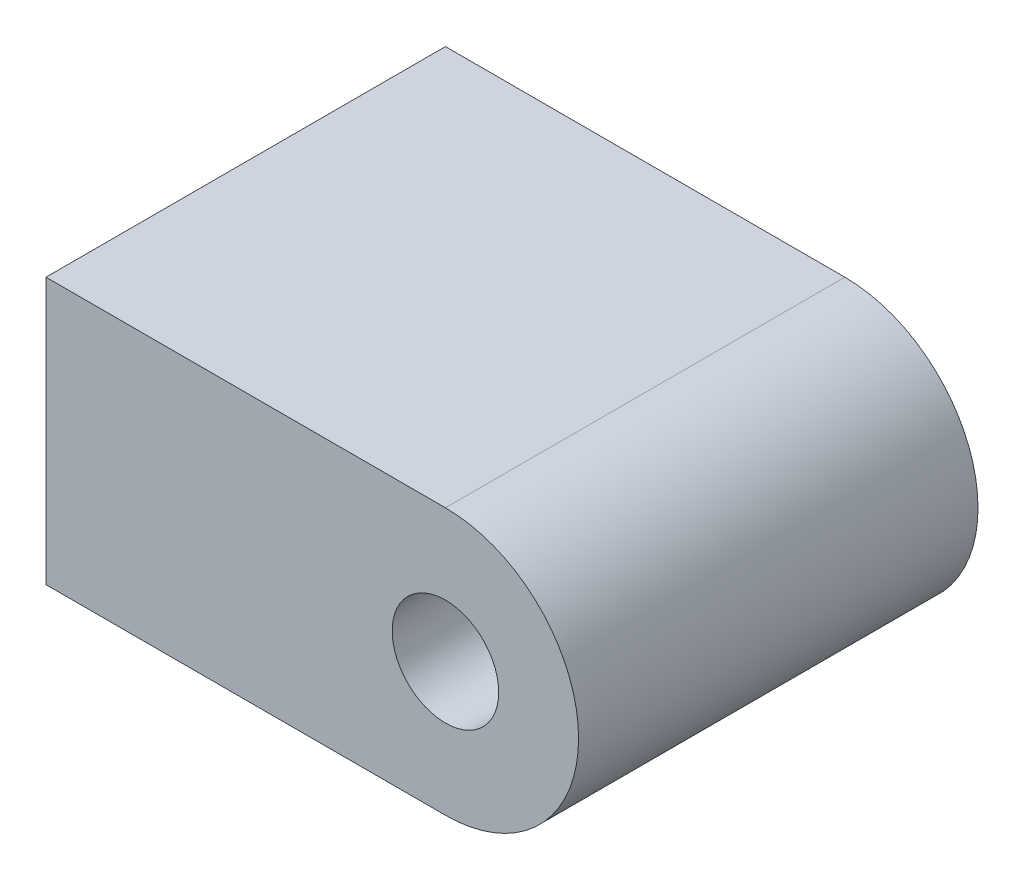
ISO-10303-21;
HEADER;
FILE_DESCRIPTION(('STEP AP214'),'2;1');
FILE_NAME('part.step','',(''),(''),'','','');
FILE_SCHEMA(('AUTOMOTIVE_DESIGN { 1 0 10303 214 1 1 1 1 }'));
ENDSEC;
DATA;
#1=APPLICATION_CONTEXT('core data for automotive mechanical design processes');
#2=APPLICATION_PROTOCOL_DEFINITION('international standard','automotive_design',2000,#1);
#3=PRODUCT_CONTEXT('',#1,'mechanical');
#4=PRODUCT('Part','Part','',(#3));
#5=PRODUCT_RELATED_PRODUCT_CATEGORY('part','',(#4));
#6=PRODUCT_DEFINITION_FORMATION('','',#4);
#7=PRODUCT_DEFINITION_CONTEXT('part definition',#1,'design');
#8=PRODUCT_DEFINITION('design','',#6,#7);
#9=PRODUCT_DEFINITION_SHAPE('','',#8);
#10=(LENGTH_UNIT() NAMED_UNIT(*) SI_UNIT(.MILLI.,.METRE.));
#11=(NAMED_UNIT(*) PLANE_ANGLE_UNIT() SI_UNIT($,.RADIAN.));
#12=(NAMED_UNIT(*) SI_UNIT($,.STERADIAN.) SOLID_ANGLE_UNIT());
#13=UNCERTAINTY_MEASURE_WITH_UNIT(LENGTH_MEASURE(1.E-05),#10,'distance_accuracy_value','');
#14=(GEOMETRIC_REPRESENTATION_CONTEXT(3) GLOBAL_UNCERTAINTY_ASSIGNED_CONTEXT((#13)) GLOBAL_UNIT_ASSIGNED_CONTEXT((#10,
#11,#12)) REPRESENTATION_CONTEXT('',''));
#15=CARTESIAN_POINT('',(0.,0.,0.));
#16=DIRECTION('',(0.,0.,1.));
#17=DIRECTION('',(1.,0.,0.));
#18=AXIS2_PLACEMENT_3D('',#15,#16,#17);
#19=CARTESIAN_POINT('',(0.,0.,150.));
#20=DIRECTION('',(0.,1.,0.));
#21=DIRECTION('',(0.,0.,1.));
#22=AXIS2_PLACEMENT_3D('',#19,#20,#21);
#23=PLANE('',#22);
#24=DIRECTION('',(1.,0.,0.));
#25=VECTOR('',#24,1.);
#26=CARTESIAN_POINT('',(0.,0.,0.));
#27=LINE('',#26,#25);
#28=CARTESIAN_POINT('',(0.,0.,0.));
#29=VERTEX_POINT('',#28);
#30=CARTESIAN_POINT('',(150.,0.,0.));
#31=VERTEX_POINT('',#30);
#32=EDGE_CURVE('E111',#29,#31,#27,.T.);
#33=ORIENTED_EDGE('',*,*,#32,.T.);
#34=DIRECTION('',(0.,0.,-1.));
#35=VECTOR('',#34,1.);
#36=CARTESIAN_POINT('',(150.,0.,150.));
#37=LINE('',#36,#35);
#38=CARTESIAN_POINT('',(150.,0.,150.));
#39=VERTEX_POINT('',#38);
#40=EDGE_CURVE('E11',#39,#31,#37,.T.);
#41=ORIENTED_EDGE('',*,*,#40,.F.);
#42=DIRECTION('',(1.,0.,0.));
#43=VECTOR('',#42,1.);
#44=CARTESIAN_POINT('',(0.,0.,150.));
#45=LINE('',#44,#43);
#46=CARTESIAN_POINT('',(0.,0.,150.));
#47=VERTEX_POINT('',#46);
#48=EDGE_CURVE('E93',#47,#39,#45,.T.);
#49=ORIENTED_EDGE('',*,*,#48,.F.);
#50=DIRECTION('',(0.,0.,-1.));
#51=VECTOR('',#50,1.);
#52=CARTESIAN_POINT('',(0.,0.,150.));
#53=LINE('',#52,#51);
#54=EDGE_CURVE('E60',#47,#29,#53,.T.);
#55=ORIENTED_EDGE('',*,*,#54,.T.);
#56=EDGE_LOOP('',(#33,#41,#49,#55));
#57=FACE_BOUND('',#56,.T.);
#58=ADVANCED_FACE('F43',(#57),#23,.F.);
#59=CARTESIAN_POINT('',(150.,50.,150.));
#60=DIRECTION('',(0.,0.,-1.));
#61=DIRECTION('',(-1.,0.,0.));
#62=AXIS2_PLACEMENT_3D('',#59,#60,#61);
#63=CYLINDRICAL_SURFACE('',#62,50.);
#64=CARTESIAN_POINT('',(150.,50.,0.));
#65=DIRECTION('',(0.,0.,1.));
#66=DIRECTION('',(1.,0.,0.));
#67=AXIS2_PLACEMENT_3D('',#64,#65,#66);
#68=CIRCLE('',#67,50.);
#69=CARTESIAN_POINT('',(150.,100.,0.));
#70=VERTEX_POINT('',#69);
#71=EDGE_CURVE('E99',#31,#70,#68,.T.);
#72=ORIENTED_EDGE('',*,*,#71,.T.);
#73=DIRECTION('',(0.,0.,-1.));
#74=VECTOR('',#73,1.);
#75=CARTESIAN_POINT('',(150.,100.,150.));
#76=LINE('',#75,#74);
#77=CARTESIAN_POINT('',(150.,100.,150.));
#78=VERTEX_POINT('',#77);
#79=EDGE_CURVE('E52',#78,#70,#76,.T.);
#80=ORIENTED_EDGE('',*,*,#79,.F.);
#81=CARTESIAN_POINT('',(150.,50.,150.));
#82=DIRECTION('',(0.,0.,1.));
#83=DIRECTION('',(1.,0.,0.));
#84=AXIS2_PLACEMENT_3D('',#81,#82,#83);
#85=CIRCLE('',#84,50.);
#86=EDGE_CURVE('E85',#39,#78,#85,.T.);
#87=ORIENTED_EDGE('',*,*,#86,.F.);
#88=ORIENTED_EDGE('',*,*,#40,.T.);
#89=EDGE_LOOP('',(#72,#80,#87,#88));
#90=FACE_BOUND('',#89,.T.);
#91=ADVANCED_FACE('F98',(#90),#63,.T.);
#92=CARTESIAN_POINT('',(0.,100.,150.));
#93=DIRECTION('',(0.,1.,0.));
#94=DIRECTION('',(0.,0.,1.));
#95=AXIS2_PLACEMENT_3D('',#92,#93,#94);
#96=PLANE('',#95);
#97=DIRECTION('',(1.,0.,0.));
#98=VECTOR('',#97,1.);
#99=CARTESIAN_POINT('',(0.,100.,0.));
#100=LINE('',#99,#98);
#101=CARTESIAN_POINT('',(0.,100.,0.));
#102=VERTEX_POINT('',#101);
#103=EDGE_CURVE('E117',#102,#70,#100,.T.);
#104=ORIENTED_EDGE('',*,*,#103,.F.);
#105=DIRECTION('',(0.,0.,-1.));
#106=VECTOR('',#105,1.);
#107=CARTESIAN_POINT('',(0.,100.,150.));
#108=LINE('',#107,#106);
#109=CARTESIAN_POINT('',(0.,100.,150.));
#110=VERTEX_POINT('',#109);
#111=EDGE_CURVE('E74',#110,#102,#108,.T.);
#112=ORIENTED_EDGE('',*,*,#111,.F.);
#113=DIRECTION('',(1.,0.,0.));
#114=VECTOR('',#113,1.);
#115=CARTESIAN_POINT('',(0.,100.,150.));
#116=LINE('',#115,#114);
#117=EDGE_CURVE('E92',#110,#78,#116,.T.);
#118=ORIENTED_EDGE('',*,*,#117,.T.);
#119=ORIENTED_EDGE('',*,*,#79,.T.);
#120=EDGE_LOOP('',(#104,#112,#118,#119));
#121=FACE_BOUND('',#120,.T.);
#122=ADVANCED_FACE('F103',(#121),#96,.T.);
#123=CARTESIAN_POINT('',(0.,0.,150.));
#124=DIRECTION('',(-1.,0.,0.));
#125=DIRECTION('',(0.,0.,1.));
#126=AXIS2_PLACEMENT_3D('',#123,#124,#125);
#127=PLANE('',#126);
#128=DIRECTION('',(0.,1.,0.));
#129=VECTOR('',#128,1.);
#130=CARTESIAN_POINT('',(0.,0.,0.));
#131=LINE('',#130,#129);
#132=EDGE_CURVE('E120',#29,#102,#131,.T.);
#133=ORIENTED_EDGE('',*,*,#132,.F.);
#134=ORIENTED_EDGE('',*,*,#54,.F.);
#135=DIRECTION('',(0.,1.,0.));
#136=VECTOR('',#135,1.);
#137=CARTESIAN_POINT('',(0.,0.,150.));
#138=LINE('',#137,#136);
#139=EDGE_CURVE('E105',#47,#110,#138,.T.);
#140=ORIENTED_EDGE('',*,*,#139,.T.);
#141=ORIENTED_EDGE('',*,*,#111,.T.);
#142=EDGE_LOOP('',(#133,#134,#140,#141));
#143=FACE_BOUND('',#142,.T.);
#144=ADVANCED_FACE('F147',(#143),#127,.T.);
#145=CARTESIAN_POINT('',(0.,0.,150.));
#146=DIRECTION('',(0.,0.,1.));
#147=DIRECTION('',(1.,0.,0.));
#148=AXIS2_PLACEMENT_3D('',#145,#146,#147);
#149=PLANE('',#148);
#150=CARTESIAN_POINT('',(150.,50.,150.));
#151=DIRECTION('',(0.,0.,1.));
#152=DIRECTION('',(1.,0.,0.));
#153=AXIS2_PLACEMENT_3D('',#150,#151,#152);
#154=CIRCLE('',#153,20.);
#155=CARTESIAN_POINT('',(170.,50.,150.));
#156=VERTEX_POINT('',#155);
#157=EDGE_CURVE('E130',#156,#156,#154,.T.);
#158=ORIENTED_EDGE('',*,*,#157,.F.);
#159=EDGE_LOOP('',(#158));
#160=FACE_BOUND('',#159,.T.);
#161=ORIENTED_EDGE('',*,*,#48,.T.);
#162=ORIENTED_EDGE('',*,*,#86,.T.);
#163=ORIENTED_EDGE('',*,*,#117,.F.);
#164=ORIENTED_EDGE('',*,*,#139,.F.);
#165=EDGE_LOOP('',(#161,#162,#163,#164));
#166=FACE_BOUND('',#165,.T.);
#167=ADVANCED_FACE('F89',(#160,#166),#149,.T.);
#168=CARTESIAN_POINT('',(0.,0.,0.));
#169=DIRECTION('',(0.,0.,1.));
#170=DIRECTION('',(1.,0.,0.));
#171=AXIS2_PLACEMENT_3D('',#168,#169,#170);
#172=PLANE('',#171);
#173=CARTESIAN_POINT('',(150.,50.,0.));
#174=DIRECTION('',(0.,0.,1.));
#175=DIRECTION('',(1.,0.,0.));
#176=AXIS2_PLACEMENT_3D('',#173,#174,#175);
#177=CIRCLE('',#176,20.);
#178=CARTESIAN_POINT('',(170.,50.,0.));
#179=VERTEX_POINT('',#178);
#180=EDGE_CURVE('E114',#179,#179,#177,.T.);
#181=ORIENTED_EDGE('',*,*,#180,.T.);
#182=EDGE_LOOP('',(#181));
#183=FACE_BOUND('',#182,.T.);
#184=ORIENTED_EDGE('',*,*,#32,.F.);
#185=ORIENTED_EDGE('',*,*,#132,.T.);
#186=ORIENTED_EDGE('',*,*,#103,.T.);
#187=ORIENTED_EDGE('',*,*,#71,.F.);
#188=EDGE_LOOP('',(#184,#185,#186,#187));
#189=FACE_BOUND('',#188,.T.);
#190=ADVANCED_FACE('F138',(#183,#189),#172,.F.);
#191=CARTESIAN_POINT('',(150.,50.,0.));
#192=DIRECTION('',(0.,0.,1.));
#193=DIRECTION('',(1.,0.,0.));
#194=AXIS2_PLACEMENT_3D('',#191,#192,#193);
#195=CYLINDRICAL_SURFACE('',#194,20.);
#196=ORIENTED_EDGE('',*,*,#180,.F.);
#197=EDGE_LOOP('',(#196));
#198=FACE_BOUND('',#197,.T.);
#199=ORIENTED_EDGE('',*,*,#157,.T.);
#200=EDGE_LOOP('',(#199));
#201=FACE_BOUND('',#200,.T.);
#202=ADVANCED_FACE('F140',(#198,#201),#195,.F.);
#203=CLOSED_SHELL('',(#58,#91,#122,#144,#167,#190,#202));
#204=MANIFOLD_SOLID_BREP('B2',#203);
#205=ADVANCED_BREP_SHAPE_REPRESENTATION('',(#18,#204),#14);
#206=SHAPE_DEFINITION_REPRESENTATION(#9,#205);
ENDSEC;
END-ISO-10303-21;
